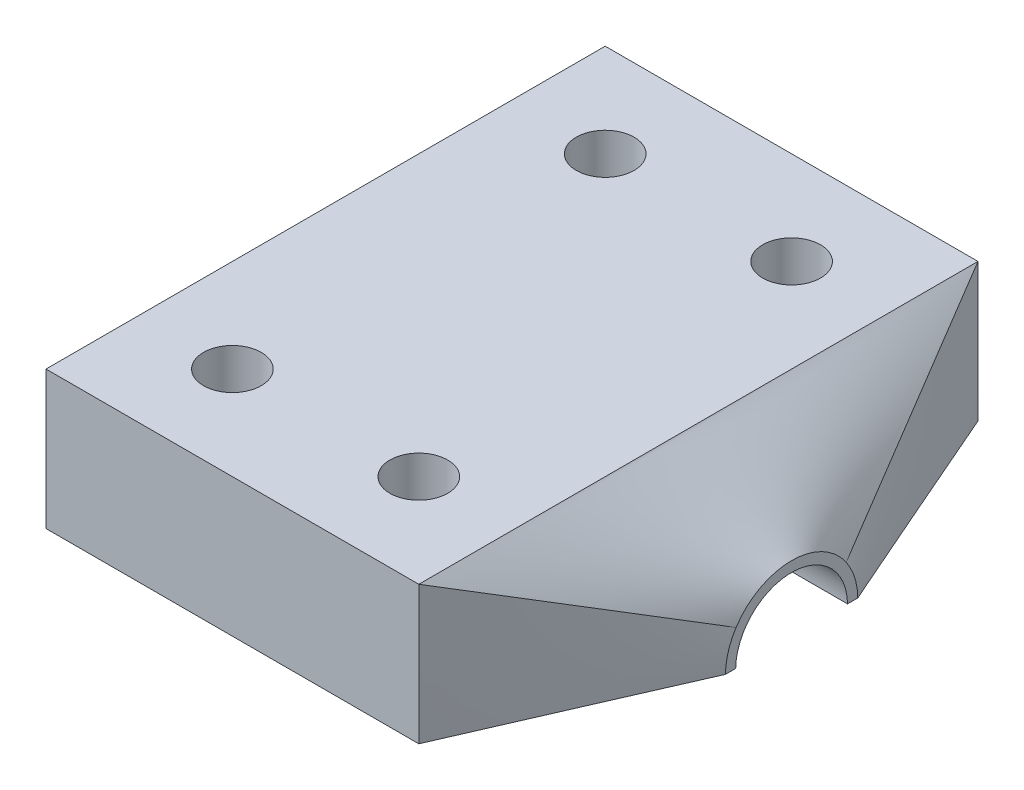
ISO-10303-21;
HEADER;
FILE_DESCRIPTION(('STEP AP214'),'2;1');
FILE_NAME('part.step','',(''),(''),'','','');
FILE_SCHEMA(('AUTOMOTIVE_DESIGN { 1 0 10303 214 1 1 1 1 }'));
ENDSEC;
DATA;
#1=APPLICATION_CONTEXT('core data for automotive mechanical design processes');
#2=APPLICATION_PROTOCOL_DEFINITION('international standard','automotive_design',2000,#1);
#3=PRODUCT_CONTEXT('',#1,'mechanical');
#4=PRODUCT('Part','Part','',(#3));
#5=PRODUCT_RELATED_PRODUCT_CATEGORY('part','',(#4));
#6=PRODUCT_DEFINITION_FORMATION('','',#4);
#7=PRODUCT_DEFINITION_CONTEXT('part definition',#1,'design');
#8=PRODUCT_DEFINITION('design','',#6,#7);
#9=PRODUCT_DEFINITION_SHAPE('','',#8);
#10=(LENGTH_UNIT() NAMED_UNIT(*) SI_UNIT(.MILLI.,.METRE.));
#11=(NAMED_UNIT(*) PLANE_ANGLE_UNIT() SI_UNIT($,.RADIAN.));
#12=(NAMED_UNIT(*) SI_UNIT($,.STERADIAN.) SOLID_ANGLE_UNIT());
#13=UNCERTAINTY_MEASURE_WITH_UNIT(LENGTH_MEASURE(1.E-05),#10,'distance_accuracy_value','');
#14=(GEOMETRIC_REPRESENTATION_CONTEXT(3) GLOBAL_UNCERTAINTY_ASSIGNED_CONTEXT((#13)) GLOBAL_UNIT_ASSIGNED_CONTEXT((#10,
#11,#12)) REPRESENTATION_CONTEXT('',''));
#15=CARTESIAN_POINT('',(0.,0.,0.));
#16=DIRECTION('',(0.,0.,1.));
#17=DIRECTION('',(1.,0.,0.));
#18=AXIS2_PLACEMENT_3D('',#15,#16,#17);
#19=CARTESIAN_POINT('',(45.05,0.0370257028590008,30.0127524367651));
#20=DIRECTION('',(0.,-1.,0.));
#21=DIRECTION('',(1.,0.,0.));
#22=AXIS2_PLACEMENT_3D('',#19,#20,#21);
#23=PLANE('',#22);
#24=CARTESIAN_POINT('',(35.05,0.0370257028589997,25.));
#25=DIRECTION('',(0.,-1.,0.));
#26=DIRECTION('',(1.,0.,0.));
#27=AXIS2_PLACEMENT_3D('',#24,#25,#26);
#28=CIRCLE('',#27,1.55);
#29=CARTESIAN_POINT('',(35.05,0.0370257028590015,26.55));
#30=VERTEX_POINT('',#29);
#31=EDGE_CURVE('E254',#30,#30,#28,.F.);
#32=ORIENTED_EDGE('',*,*,#31,.T.);
#33=EDGE_LOOP('',(#32));
#34=FACE_BOUND('',#33,.T.);
#35=DIRECTION('',(0.,0.,-1.));
#36=VECTOR('',#35,1.);
#37=CARTESIAN_POINT('',(20.05,0.0370257028589976,30.0127524367651));
#38=LINE('',#37,#36);
#39=CARTESIAN_POINT('',(20.05,0.0370257028589976,30.));
#40=VERTEX_POINT('',#39);
#41=CARTESIAN_POINT('',(20.05,0.0370257028589976,17.9997715075198));
#42=VERTEX_POINT('',#41);
#43=EDGE_CURVE('E54',#40,#42,#38,.T.);
#44=ORIENTED_EDGE('',*,*,#43,.T.);
#45=DIRECTION('',(1.,0.,0.));
#46=VECTOR('',#45,1.);
#47=CARTESIAN_POINT('',(-40.05,0.03702570285899,17.9997715075198));
#48=LINE('',#47,#46);
#49=CARTESIAN_POINT('',(45.05,0.0370257028590008,17.9997715075198));
#50=VERTEX_POINT('',#49);
#51=EDGE_CURVE('E270',#42,#50,#48,.T.);
#52=ORIENTED_EDGE('',*,*,#51,.T.);
#53=DIRECTION('',(0.,0.,-1.));
#54=VECTOR('',#53,1.);
#55=CARTESIAN_POINT('',(45.05,0.0370257028590008,15.));
#56=LINE('',#55,#54);
#57=CARTESIAN_POINT('',(45.05,0.0370258182484606,18.5498019466976));
#58=VERTEX_POINT('',#57);
#59=EDGE_CURVE('E194',#58,#50,#56,.T.);
#60=ORIENTED_EDGE('',*,*,#59,.F.);
#61=CARTESIAN_POINT('',(40.05,0.0370257028590006,30.));
#62=CARTESIAN_POINT('',(40.3292071352656,0.0370257028590005,29.3585714856252));
#63=CARTESIAN_POINT('',(40.6084542183621,0.0370257028590004,28.7171603406194));
#64=CARTESIAN_POINT('',(41.1670937679775,0.0370257028590002,27.4344011013695));
#65=CARTESIAN_POINT('',(41.446486234547,0.0370257028590002,26.7930530071475));
#66=CARTESIAN_POINT('',(42.0022245872801,0.0370257028590003,25.5179223405798));
#67=CARTESIAN_POINT('',(42.2785680325368,0.0370257028590004,24.8841387045098));
#68=CARTESIAN_POINT('',(42.831579961269,0.0370257028590006,23.6167132875389));
#69=CARTESIAN_POINT('',(43.1082484447091,0.0370257028590008,22.9830715066226));
#70=CARTESIAN_POINT('',(43.5236503493965,0.0370257028590007,22.0327827080655));
#71=CARTESIAN_POINT('',(43.6621842933627,0.0370257028590007,21.7160484972843));
#72=CARTESIAN_POINT('',(43.9394178605991,0.0370257028590006,21.0826525635881));
#73=CARTESIAN_POINT('',(44.0781174838773,0.0370257028590007,20.7659908406768));
#74=CARTESIAN_POINT('',(44.3557004955791,0.0370257028590007,20.1327477843524));
#75=CARTESIAN_POINT('',(44.4945838840896,0.0370257028590008,19.8161664509775));
#76=CARTESIAN_POINT('',(44.7029612721802,0.0370257028590007,19.3413174133347));
#77=CARTESIAN_POINT('',(44.7724291171483,0.0370257028590007,19.1830382322972));
#78=CARTESIAN_POINT('',(44.9112918623569,0.0370257028590009,18.8664478837573));
#79=CARTESIAN_POINT('',(44.9806867625976,0.0370257028590011,18.7081367162549));
#80=CARTESIAN_POINT('',(45.05,0.0370257028590016,18.5497897364898));
#81=B_SPLINE_CURVE_WITH_KNOTS('',3,(#61,#62,#63,#64,#65,#66,#67,#68,#69,#70,#71,#72,#73,#74,#75,
#76,#77,#78,#79,#80),.UNSPECIFIED.,.F.,.F.,(4,2,2,2,2,2,2,2,2,4),(0.,2.09868639503427,
4.19737352285042,6.27160263132695,8.34583151303325,9.38294763563716,10.4200638090277,
11.4571804738877,11.9757387772216,12.4942970798716),.UNSPECIFIED.);
#82=CARTESIAN_POINT('',(40.05,0.0370257028590008,30.));
#83=VERTEX_POINT('',#82);
#84=EDGE_CURVE('E109',#83,#58,#81,.T.);
#85=ORIENTED_EDGE('',*,*,#84,.F.);
#86=DIRECTION('',(1.,0.,0.));
#87=VECTOR('',#86,1.);
#88=CARTESIAN_POINT('',(0.,0.0370257028589951,30.));
#89=LINE('',#88,#87);
#90=EDGE_CURVE('E243',#40,#83,#89,.T.);
#91=ORIENTED_EDGE('',*,*,#90,.F.);
#92=EDGE_LOOP('',(#44,#52,#60,#85,#91));
#93=FACE_BOUND('',#92,.T.);
#94=CARTESIAN_POINT('',(25.05,0.0370257028589997,25.));
#95=DIRECTION('',(0.,-1.,0.));
#96=DIRECTION('',(1.,0.,0.));
#97=AXIS2_PLACEMENT_3D('',#94,#95,#96);
#98=CIRCLE('',#97,1.55);
#99=CARTESIAN_POINT('',(25.05,0.0370257028590015,26.55));
#100=VERTEX_POINT('',#99);
#101=EDGE_CURVE('E257',#100,#100,#98,.F.);
#102=ORIENTED_EDGE('',*,*,#101,.T.);
#103=EDGE_LOOP('',(#102));
#104=FACE_BOUND('',#103,.T.);
#105=ADVANCED_FACE('F38',(#34,#93,#104),#23,.T.);
#106=CARTESIAN_POINT('',(45.05,0.0370257028590008,12.0002284924802));
#107=VERTEX_POINT('',#106);
#108=CARTESIAN_POINT('',(45.05,0.0370256987457916,11.4501936569152));
#109=VERTEX_POINT('',#108);
#110=EDGE_CURVE('E193',#107,#109,#56,.T.);
#111=ORIENTED_EDGE('',*,*,#110,.F.);
#112=DIRECTION('',(1.,0.,0.));
#113=VECTOR('',#112,1.);
#114=CARTESIAN_POINT('',(-40.05,0.03702570285899,12.0002284924802));
#115=LINE('',#114,#113);
#116=CARTESIAN_POINT('',(20.05,0.0370257028589976,12.0002284924802));
#117=VERTEX_POINT('',#116);
#118=EDGE_CURVE('E266',#107,#117,#115,.F.);
#119=ORIENTED_EDGE('',*,*,#118,.T.);
#120=CARTESIAN_POINT('',(20.05,0.0370257028589976,0.));
#121=VERTEX_POINT('',#120);
#122=EDGE_CURVE('E11',#117,#121,#38,.T.);
#123=ORIENTED_EDGE('',*,*,#122,.T.);
#124=DIRECTION('',(1.,0.,0.));
#125=VECTOR('',#124,1.);
#126=CARTESIAN_POINT('',(0.,0.0370257028589951,0.));
#127=LINE('',#126,#125);
#128=CARTESIAN_POINT('',(40.05,0.0370257028590008,0.));
#129=VERTEX_POINT('',#128);
#130=EDGE_CURVE('E265',#121,#129,#127,.T.);
#131=ORIENTED_EDGE('',*,*,#130,.T.);
#132=CARTESIAN_POINT('',(45.05,0.0370257059285482,11.4501932563122));
#133=CARTESIAN_POINT('',(44.9804625166813,0.0370257039614731,11.2914067524102));
#134=CARTESIAN_POINT('',(44.9108035531583,0.0370257031544413,11.1326735887409));
#135=CARTESIAN_POINT('',(44.7713727466116,0.0370257025635602,10.8152568324995));
#136=CARTESIAN_POINT('',(44.7016009035911,0.0370257027797109,10.6565732399259));
#137=CARTESIAN_POINT('',(44.562074404052,0.0370257029382906,10.3391984826073));
#138=CARTESIAN_POINT('',(44.4923197475361,0.0370257028807197,10.1805073178611));
#139=CARTESIAN_POINT('',(44.3528563580479,0.0370257028372818,9.8631048107067));
#140=CARTESIAN_POINT('',(44.2831476250742,0.0370257028514148,9.7043934682992));
#141=CARTESIAN_POINT('',(44.0741129700596,0.0370257028741726,9.2282195789992));
#142=CARTESIAN_POINT('',(43.9348784701332,0.0370257028631564,8.9107168931688));
#143=CARTESIAN_POINT('',(43.6566409898737,0.0370257028548449,8.27561014736592));
#144=CARTESIAN_POINT('',(43.5176380095165,0.0370257028575497,7.95800608740401));
#145=CARTESIAN_POINT('',(43.1004572100972,0.0370257028619075,7.00404775090638));
#146=CARTESIAN_POINT('',(42.8225570814266,0.0370257028597831,6.36757204723251));
#147=CARTESIAN_POINT('',(42.2672100536651,0.0370257028582178,5.09442287175885));
#148=CARTESIAN_POINT('',(41.9897631546731,0.0370257028587768,4.457749399916));
#149=CARTESIAN_POINT('',(41.4351552447464,0.0370257028592238,3.18427680911127));
#150=CARTESIAN_POINT('',(41.1579942342488,0.0370257028591119,2.5474776899591));
#151=CARTESIAN_POINT('',(40.6038704986088,0.0370257028588887,1.2737936657087));
#152=CARTESIAN_POINT('',(40.3269077733397,0.0370257028587775,0.636908760665631));
#153=CARTESIAN_POINT('',(40.05,0.0370257028590025,0.));
#154=B_SPLINE_CURVE_WITH_KNOTS('',3,(#132,#133,#134,#135,#136,#137,#138,#139,#140,#141,#142,
#143,#144,#145,#146,#147,#148,#149,#150,#151,#152,#153),.UNSPECIFIED.,.F.,.F.,(4,2,2,2,2,2,2,2,
2,2,4),(0.,0.520035878670811,1.04007174301885,1.56010768981918,2.08014361904961,
3.12021457011607,4.160285412682,6.24378410013633,8.32728324129482,10.4107855621992,
12.4942865497071),.UNSPECIFIED.);
#155=EDGE_CURVE('E178',#109,#129,#154,.T.);
#156=ORIENTED_EDGE('',*,*,#155,.F.);
#157=EDGE_LOOP('',(#111,#119,#123,#131,#156));
#158=FACE_BOUND('',#157,.T.);
#159=CARTESIAN_POINT('',(25.05,0.0370257028589997,5.));
#160=DIRECTION('',(0.,-1.,0.));
#161=DIRECTION('',(1.,0.,0.));
#162=AXIS2_PLACEMENT_3D('',#159,#160,#161);
#163=CIRCLE('',#162,1.55);
#164=CARTESIAN_POINT('',(25.05,0.0370257028590015,6.55));
#165=VERTEX_POINT('',#164);
#166=EDGE_CURVE('E302',#165,#165,#163,.F.);
#167=ORIENTED_EDGE('',*,*,#166,.T.);
#168=EDGE_LOOP('',(#167));
#169=FACE_BOUND('',#168,.T.);
#170=CARTESIAN_POINT('',(35.05,0.0370257028589997,5.));
#171=DIRECTION('',(0.,-1.,0.));
#172=DIRECTION('',(1.,0.,0.));
#173=AXIS2_PLACEMENT_3D('',#170,#171,#172);
#174=CIRCLE('',#173,1.55);
#175=CARTESIAN_POINT('',(35.05,0.0370257028590015,6.55));
#176=VERTEX_POINT('',#175);
#177=EDGE_CURVE('E299',#176,#176,#174,.F.);
#178=ORIENTED_EDGE('',*,*,#177,.T.);
#179=EDGE_LOOP('',(#178));
#180=FACE_BOUND('',#179,.T.);
#181=ADVANCED_FACE('F207',(#158,#169,#180),#23,.T.);
#182=CARTESIAN_POINT('',(20.05,0.0370257028589976,30.0127524367651));
#183=DIRECTION('',(-1.,0.,0.));
#184=DIRECTION('',(0.,0.,1.));
#185=AXIS2_PLACEMENT_3D('',#182,#183,#184);
#186=PLANE('',#185);
#187=DIRECTION('',(0.,-1.,0.));
#188=VECTOR('',#187,1.);
#189=CARTESIAN_POINT('',(20.05,0.,30.));
#190=LINE('',#189,#188);
#191=CARTESIAN_POINT('',(20.05,7.45000000000001,30.));
#192=VERTEX_POINT('',#191);
#193=EDGE_CURVE('E240',#192,#40,#190,.T.);
#194=ORIENTED_EDGE('',*,*,#193,.F.);
#195=DIRECTION('',(0.,0.,1.));
#196=VECTOR('',#195,1.);
#197=CARTESIAN_POINT('',(20.05,7.45000000000001,-28.2842712474619));
#198=LINE('',#197,#196);
#199=CARTESIAN_POINT('',(20.05,7.45000000000001,0.));
#200=VERTEX_POINT('',#199);
#201=EDGE_CURVE('E183',#200,#192,#198,.T.);
#202=ORIENTED_EDGE('',*,*,#201,.F.);
#203=DIRECTION('',(0.,-1.,0.));
#204=VECTOR('',#203,1.);
#205=CARTESIAN_POINT('',(20.05,0.,0.));
#206=LINE('',#205,#204);
#207=EDGE_CURVE('E263',#200,#121,#206,.T.);
#208=ORIENTED_EDGE('',*,*,#207,.T.);
#209=ORIENTED_EDGE('',*,*,#122,.F.);
#210=CARTESIAN_POINT('',(20.05,0.,15.));
#211=DIRECTION('',(-1.,0.,0.));
#212=DIRECTION('',(0.,0.,1.));
#213=AXIS2_PLACEMENT_3D('',#210,#211,#212);
#214=CIRCLE('',#213,3.);
#215=EDGE_CURVE('E305',#117,#42,#214,.F.);
#216=ORIENTED_EDGE('',*,*,#215,.T.);
#217=ORIENTED_EDGE('',*,*,#43,.F.);
#218=EDGE_LOOP('',(#194,#202,#208,#209,#216,#217));
#219=FACE_BOUND('',#218,.T.);
#220=ADVANCED_FACE('F209',(#219),#186,.T.);
#221=CARTESIAN_POINT('',(20.05,7.45000000000001,-28.2842712474619));
#222=DIRECTION('',(0.,1.,0.));
#223=DIRECTION('',(0.,0.,1.));
#224=AXIS2_PLACEMENT_3D('',#221,#222,#223);
#225=PLANE('',#224);
#226=CARTESIAN_POINT('',(25.05,7.45000000000001,25.));
#227=DIRECTION('',(0.,1.,0.));
#228=DIRECTION('',(0.,0.,-1.));
#229=AXIS2_PLACEMENT_3D('',#226,#227,#228);
#230=CIRCLE('',#229,1.55);
#231=CARTESIAN_POINT('',(25.05,7.45,26.55));
#232=VERTEX_POINT('',#231);
#233=EDGE_CURVE('E284',#232,#232,#230,.T.);
#234=ORIENTED_EDGE('',*,*,#233,.F.);
#235=EDGE_LOOP('',(#234));
#236=FACE_BOUND('',#235,.T.);
#237=CARTESIAN_POINT('',(35.05,7.45000000000001,25.));
#238=DIRECTION('',(0.,1.,0.));
#239=DIRECTION('',(0.,0.,-1.));
#240=AXIS2_PLACEMENT_3D('',#237,#238,#239);
#241=CIRCLE('',#240,1.55);
#242=CARTESIAN_POINT('',(35.05,7.45,26.55));
#243=VERTEX_POINT('',#242);
#244=EDGE_CURVE('E287',#243,#243,#241,.T.);
#245=ORIENTED_EDGE('',*,*,#244,.F.);
#246=EDGE_LOOP('',(#245));
#247=FACE_BOUND('',#246,.T.);
#248=CARTESIAN_POINT('',(35.05,7.45000000000001,5.));
#249=DIRECTION('',(0.,1.,0.));
#250=DIRECTION('',(0.,0.,1.));
#251=AXIS2_PLACEMENT_3D('',#248,#249,#250);
#252=CIRCLE('',#251,1.55);
#253=CARTESIAN_POINT('',(35.05,7.45,6.55));
#254=VERTEX_POINT('',#253);
#255=EDGE_CURVE('E292',#254,#254,#252,.T.);
#256=ORIENTED_EDGE('',*,*,#255,.F.);
#257=EDGE_LOOP('',(#256));
#258=FACE_BOUND('',#257,.T.);
#259=CARTESIAN_POINT('',(25.05,7.45000000000001,5.));
#260=DIRECTION('',(0.,1.,0.));
#261=DIRECTION('',(0.,0.,1.));
#262=AXIS2_PLACEMENT_3D('',#259,#260,#261);
#263=CIRCLE('',#262,1.55);
#264=CARTESIAN_POINT('',(25.05,7.45,6.55));
#265=VERTEX_POINT('',#264);
#266=EDGE_CURVE('E99',#265,#265,#263,.T.);
#267=ORIENTED_EDGE('',*,*,#266,.F.);
#268=EDGE_LOOP('',(#267));
#269=FACE_BOUND('',#268,.T.);
#270=DIRECTION('',(1.,0.,0.));
#271=VECTOR('',#270,1.);
#272=CARTESIAN_POINT('',(20.05,7.45000000000001,0.));
#273=LINE('',#272,#271);
#274=CARTESIAN_POINT('',(40.05,7.45000000000001,0.));
#275=VERTEX_POINT('',#274);
#276=EDGE_CURVE('E185',#200,#275,#273,.T.);
#277=ORIENTED_EDGE('',*,*,#276,.F.);
#278=ORIENTED_EDGE('',*,*,#201,.T.);
#279=DIRECTION('',(-1.,0.,0.));
#280=VECTOR('',#279,1.);
#281=CARTESIAN_POINT('',(20.05,7.45000000000001,30.));
#282=LINE('',#281,#280);
#283=CARTESIAN_POINT('',(40.05,7.45000000000001,30.));
#284=VERTEX_POINT('',#283);
#285=EDGE_CURVE('E182',#284,#192,#282,.T.);
#286=ORIENTED_EDGE('',*,*,#285,.F.);
#287=DIRECTION('',(0.,0.,1.));
#288=VECTOR('',#287,1.);
#289=CARTESIAN_POINT('',(40.05,7.45000000000001,-28.2842712474619));
#290=LINE('',#289,#288);
#291=EDGE_CURVE('E95',#275,#284,#290,.T.);
#292=ORIENTED_EDGE('',*,*,#291,.F.);
#293=EDGE_LOOP('',(#277,#278,#286,#292));
#294=FACE_BOUND('',#293,.T.);
#295=ADVANCED_FACE('F218',(#236,#247,#258,#269,#294),#225,.T.);
#296=CARTESIAN_POINT('',(35.05,-12.5527524367651,5.));
#297=DIRECTION('',(0.,1.,0.));
#298=DIRECTION('',(0.,0.,1.));
#299=AXIS2_PLACEMENT_3D('',#296,#297,#298);
#300=CYLINDRICAL_SURFACE('',#299,1.55);
#301=CARTESIAN_POINT('',(35.05,7.45,6.55));
#302=CARTESIAN_POINT('',(35.05,7.37278151773812,6.55));
#303=CARTESIAN_POINT('',(35.05,7.29556303547623,6.55));
#304=CARTESIAN_POINT('',(35.05,7.14112607095246,6.55));
#305=CARTESIAN_POINT('',(35.05,7.06390758869057,6.55));
#306=CARTESIAN_POINT('',(35.05,6.9094706241668,6.55));
#307=CARTESIAN_POINT('',(35.05,6.83225214190492,6.55));
#308=CARTESIAN_POINT('',(35.05,6.67781517738115,6.55));
#309=CARTESIAN_POINT('',(35.05,6.60059669511926,6.55));
#310=CARTESIAN_POINT('',(35.05,6.44615973059549,6.55));
#311=CARTESIAN_POINT('',(35.05,6.36894124833361,6.55));
#312=CARTESIAN_POINT('',(35.05,6.21450428380983,6.55));
#313=CARTESIAN_POINT('',(35.05,6.13728580154795,6.55));
#314=CARTESIAN_POINT('',(35.05,5.98284883702418,6.55));
#315=CARTESIAN_POINT('',(35.05,5.90563035476229,6.55));
#316=CARTESIAN_POINT('',(35.05,5.75119339023852,6.55));
#317=CARTESIAN_POINT('',(35.05,5.67397490797664,6.55));
#318=CARTESIAN_POINT('',(35.05,5.51953794345287,6.55));
#319=CARTESIAN_POINT('',(35.05,5.44231946119098,6.55));
#320=CARTESIAN_POINT('',(35.05,5.28788249666721,6.55));
#321=CARTESIAN_POINT('',(35.05,5.21066401440532,6.55));
#322=CARTESIAN_POINT('',(35.05,5.05622704988155,6.55));
#323=CARTESIAN_POINT('',(35.05,4.97900856761967,6.55));
#324=CARTESIAN_POINT('',(35.05,4.8245716030959,6.55));
#325=CARTESIAN_POINT('',(35.05,4.74735312083401,6.55));
#326=CARTESIAN_POINT('',(35.05,4.59291615631024,6.55));
#327=CARTESIAN_POINT('',(35.05,4.51569767404836,6.55));
#328=CARTESIAN_POINT('',(35.05,4.36126070952458,6.55));
#329=CARTESIAN_POINT('',(35.05,4.2840422272627,6.55));
#330=CARTESIAN_POINT('',(35.05,4.12960526273893,6.55));
#331=CARTESIAN_POINT('',(35.05,4.05238678047704,6.55));
#332=CARTESIAN_POINT('',(35.05,3.89794981595327,6.55));
#333=CARTESIAN_POINT('',(35.05,3.82073133369139,6.55));
#334=CARTESIAN_POINT('',(35.05,3.66629436916761,6.55));
#335=CARTESIAN_POINT('',(35.05,3.58907588690573,6.55));
#336=CARTESIAN_POINT('',(35.05,3.43463892238196,6.55));
#337=CARTESIAN_POINT('',(35.05,3.35742044012007,6.55));
#338=CARTESIAN_POINT('',(35.05,3.2029834755963,6.55));
#339=CARTESIAN_POINT('',(35.05,3.12576499333442,6.55));
#340=CARTESIAN_POINT('',(35.05,2.97132802881065,6.55));
#341=CARTESIAN_POINT('',(35.05,2.89410954654876,6.55));
#342=CARTESIAN_POINT('',(35.05,2.73967258202499,6.55));
#343=CARTESIAN_POINT('',(35.05,2.66245409976311,6.55));
#344=CARTESIAN_POINT('',(35.05,2.50801713523934,6.55));
#345=CARTESIAN_POINT('',(35.05,2.43079865297745,6.55));
#346=CARTESIAN_POINT('',(35.05,2.27636168845368,6.55));
#347=CARTESIAN_POINT('',(35.05,2.19914320619179,6.55));
#348=CARTESIAN_POINT('',(35.05,2.04470624166802,6.55));
#349=CARTESIAN_POINT('',(35.05,1.96748775940614,6.55));
#350=CARTESIAN_POINT('',(35.05,1.81305079488237,6.55));
#351=CARTESIAN_POINT('',(35.05,1.73583231262048,6.55));
#352=CARTESIAN_POINT('',(35.05,1.58139534809671,6.55));
#353=CARTESIAN_POINT('',(35.05,1.50417686583483,6.55));
#354=CARTESIAN_POINT('',(35.05,1.34973990131105,6.55));
#355=CARTESIAN_POINT('',(35.05,1.27252141904917,6.55));
#356=CARTESIAN_POINT('',(35.05,1.1180844545254,6.55));
#357=CARTESIAN_POINT('',(35.05,1.04086597226351,6.55));
#358=CARTESIAN_POINT('',(35.05,0.886429007739741,6.55));
#359=CARTESIAN_POINT('',(35.05,0.809210525477856,6.55));
#360=CARTESIAN_POINT('',(35.05,0.654773560954086,6.55));
#361=CARTESIAN_POINT('',(35.05,0.5775550786922,6.55));
#362=CARTESIAN_POINT('',(35.05,0.423118114168428,6.55));
#363=CARTESIAN_POINT('',(35.05,0.345899631906543,6.55));
#364=CARTESIAN_POINT('',(35.05,0.191462667382772,6.55));
#365=CARTESIAN_POINT('',(35.05,0.114244185120887,6.55));
#366=CARTESIAN_POINT('',(35.05,0.0370257028590015,6.55));
#367=B_SPLINE_CURVE_WITH_KNOTS('',3,(#301,#302,#303,#304,#305,#306,#307,#308,#309,#310,#311,
#312,#313,#314,#315,#316,#317,#318,#319,#320,#321,#322,#323,#324,#325,#326,#327,#328,#329,#330,
#331,#332,#333,#334,#335,#336,#337,#338,#339,#340,#341,#342,#343,#344,#345,#346,#347,#348,#349,
#350,#351,#352,#353,#354,#355,#356,#357,#358,#359,#360,#361,#362,#363,#364,#365,#366),
.UNSPECIFIED.,.F.,.F.,(4,2,2,2,2,2,2,2,2,2,2,2,2,2,2,2,2,2,2,2,2,2,2,2,2,2,2,2,2,2,2,2,4),(0.,
0.231655446785658,0.463310893571312,0.69496634035697,0.926621787142624,1.15827723392828,
1.38993268071394,1.62158812749959,1.85324357428525,2.08489902107091,2.31655446785656,
2.54820991464222,2.77986536142788,3.01152080821353,3.24317625499919,3.47483170178484,
3.7064871485705,3.93814259535616,4.16979804214181,4.40145348892747,4.63310893571312,
4.86476438249878,5.09641982928444,5.32807527607009,5.55973072285575,5.79138616964141,
6.02304161642706,6.25469706321272,6.48635250999838,6.71800795678403,6.94966340356969,
7.18131885035534,7.412974297141),.UNSPECIFIED.);
#368=EDGE_CURVE('BSEAM220',#254,#176,#367,.T.);
#369=ORIENTED_EDGE('',*,*,#255,.T.);
#370=ORIENTED_EDGE('',*,*,#177,.F.);
#371=ORIENTED_EDGE('',*,*,#368,.T.);
#372=ORIENTED_EDGE('',*,*,#368,.F.);
#373=EDGE_LOOP('',(#369,#371,#370,#372));
#374=FACE_BOUND('',#373,.T.);
#375=ADVANCED_FACE('F220',(#374),#300,.F.);
#376=CARTESIAN_POINT('',(25.05,-12.5527524367651,5.));
#377=DIRECTION('',(0.,1.,0.));
#378=DIRECTION('',(0.,0.,1.));
#379=AXIS2_PLACEMENT_3D('',#376,#377,#378);
#380=CYLINDRICAL_SURFACE('',#379,1.55);
#381=CARTESIAN_POINT('',(25.05,7.45,6.55));
#382=CARTESIAN_POINT('',(25.05,7.37278151773812,6.55));
#383=CARTESIAN_POINT('',(25.05,7.29556303547623,6.55));
#384=CARTESIAN_POINT('',(25.05,7.14112607095246,6.55));
#385=CARTESIAN_POINT('',(25.05,7.06390758869057,6.55));
#386=CARTESIAN_POINT('',(25.05,6.9094706241668,6.55));
#387=CARTESIAN_POINT('',(25.05,6.83225214190492,6.55));
#388=CARTESIAN_POINT('',(25.05,6.67781517738115,6.55));
#389=CARTESIAN_POINT('',(25.05,6.60059669511926,6.55));
#390=CARTESIAN_POINT('',(25.05,6.44615973059549,6.55));
#391=CARTESIAN_POINT('',(25.05,6.36894124833361,6.55));
#392=CARTESIAN_POINT('',(25.05,6.21450428380983,6.55));
#393=CARTESIAN_POINT('',(25.05,6.13728580154795,6.55));
#394=CARTESIAN_POINT('',(25.05,5.98284883702418,6.55));
#395=CARTESIAN_POINT('',(25.05,5.90563035476229,6.55));
#396=CARTESIAN_POINT('',(25.05,5.75119339023852,6.55));
#397=CARTESIAN_POINT('',(25.05,5.67397490797664,6.55));
#398=CARTESIAN_POINT('',(25.05,5.51953794345287,6.55));
#399=CARTESIAN_POINT('',(25.05,5.44231946119098,6.55));
#400=CARTESIAN_POINT('',(25.05,5.28788249666721,6.55));
#401=CARTESIAN_POINT('',(25.05,5.21066401440532,6.55));
#402=CARTESIAN_POINT('',(25.05,5.05622704988155,6.55));
#403=CARTESIAN_POINT('',(25.05,4.97900856761967,6.55));
#404=CARTESIAN_POINT('',(25.05,4.8245716030959,6.55));
#405=CARTESIAN_POINT('',(25.05,4.74735312083401,6.55));
#406=CARTESIAN_POINT('',(25.05,4.59291615631024,6.55));
#407=CARTESIAN_POINT('',(25.05,4.51569767404836,6.55));
#408=CARTESIAN_POINT('',(25.05,4.36126070952458,6.55));
#409=CARTESIAN_POINT('',(25.05,4.2840422272627,6.55));
#410=CARTESIAN_POINT('',(25.05,4.12960526273893,6.55));
#411=CARTESIAN_POINT('',(25.05,4.05238678047704,6.55));
#412=CARTESIAN_POINT('',(25.05,3.89794981595327,6.55));
#413=CARTESIAN_POINT('',(25.05,3.82073133369139,6.55));
#414=CARTESIAN_POINT('',(25.05,3.66629436916761,6.55));
#415=CARTESIAN_POINT('',(25.05,3.58907588690573,6.55));
#416=CARTESIAN_POINT('',(25.05,3.43463892238196,6.55));
#417=CARTESIAN_POINT('',(25.05,3.35742044012007,6.55));
#418=CARTESIAN_POINT('',(25.05,3.2029834755963,6.55));
#419=CARTESIAN_POINT('',(25.05,3.12576499333442,6.55));
#420=CARTESIAN_POINT('',(25.05,2.97132802881065,6.55));
#421=CARTESIAN_POINT('',(25.05,2.89410954654876,6.55));
#422=CARTESIAN_POINT('',(25.05,2.73967258202499,6.55));
#423=CARTESIAN_POINT('',(25.05,2.66245409976311,6.55));
#424=CARTESIAN_POINT('',(25.05,2.50801713523934,6.55));
#425=CARTESIAN_POINT('',(25.05,2.43079865297745,6.55));
#426=CARTESIAN_POINT('',(25.05,2.27636168845368,6.55));
#427=CARTESIAN_POINT('',(25.05,2.19914320619179,6.55));
#428=CARTESIAN_POINT('',(25.05,2.04470624166802,6.55));
#429=CARTESIAN_POINT('',(25.05,1.96748775940614,6.55));
#430=CARTESIAN_POINT('',(25.05,1.81305079488237,6.55));
#431=CARTESIAN_POINT('',(25.05,1.73583231262048,6.55));
#432=CARTESIAN_POINT('',(25.05,1.58139534809671,6.55));
#433=CARTESIAN_POINT('',(25.05,1.50417686583483,6.55));
#434=CARTESIAN_POINT('',(25.05,1.34973990131105,6.55));
#435=CARTESIAN_POINT('',(25.05,1.27252141904917,6.55));
#436=CARTESIAN_POINT('',(25.05,1.1180844545254,6.55));
#437=CARTESIAN_POINT('',(25.05,1.04086597226351,6.55));
#438=CARTESIAN_POINT('',(25.05,0.886429007739741,6.55));
#439=CARTESIAN_POINT('',(25.05,0.809210525477856,6.55));
#440=CARTESIAN_POINT('',(25.05,0.654773560954086,6.55));
#441=CARTESIAN_POINT('',(25.05,0.5775550786922,6.55));
#442=CARTESIAN_POINT('',(25.05,0.423118114168428,6.55));
#443=CARTESIAN_POINT('',(25.05,0.345899631906543,6.55));
#444=CARTESIAN_POINT('',(25.05,0.191462667382772,6.55));
#445=CARTESIAN_POINT('',(25.05,0.114244185120887,6.55));
#446=CARTESIAN_POINT('',(25.05,0.0370257028590015,6.55));
#447=B_SPLINE_CURVE_WITH_KNOTS('',3,(#381,#382,#383,#384,#385,#386,#387,#388,#389,#390,#391,
#392,#393,#394,#395,#396,#397,#398,#399,#400,#401,#402,#403,#404,#405,#406,#407,#408,#409,#410,
#411,#412,#413,#414,#415,#416,#417,#418,#419,#420,#421,#422,#423,#424,#425,#426,#427,#428,#429,
#430,#431,#432,#433,#434,#435,#436,#437,#438,#439,#440,#441,#442,#443,#444,#445,#446),
.UNSPECIFIED.,.F.,.F.,(4,2,2,2,2,2,2,2,2,2,2,2,2,2,2,2,2,2,2,2,2,2,2,2,2,2,2,2,2,2,2,2,4),(0.,
0.231655446785658,0.463310893571312,0.69496634035697,0.926621787142624,1.15827723392828,
1.38993268071394,1.62158812749959,1.85324357428525,2.08489902107091,2.31655446785656,
2.54820991464222,2.77986536142788,3.01152080821353,3.24317625499919,3.47483170178484,
3.7064871485705,3.93814259535616,4.16979804214181,4.40145348892747,4.63310893571312,
4.86476438249878,5.09641982928444,5.32807527607009,5.55973072285575,5.79138616964141,
6.02304161642706,6.25469706321272,6.48635250999838,6.71800795678403,6.94966340356969,
7.18131885035534,7.412974297141),.UNSPECIFIED.);
#448=EDGE_CURVE('BSEAM223',#265,#165,#447,.T.);
#449=ORIENTED_EDGE('',*,*,#266,.T.);
#450=ORIENTED_EDGE('',*,*,#166,.F.);
#451=ORIENTED_EDGE('',*,*,#448,.T.);
#452=ORIENTED_EDGE('',*,*,#448,.F.);
#453=EDGE_LOOP('',(#449,#451,#450,#452));
#454=FACE_BOUND('',#453,.T.);
#455=ADVANCED_FACE('F223',(#454),#380,.F.);
#456=CARTESIAN_POINT('',(0.,0.,30.));
#457=DIRECTION('',(0.,0.,1.));
#458=DIRECTION('',(1.,0.,0.));
#459=AXIS2_PLACEMENT_3D('',#456,#457,#458);
#460=PLANE('',#459);
#461=ORIENTED_EDGE('',*,*,#193,.T.);
#462=ORIENTED_EDGE('',*,*,#90,.T.);
#463=DIRECTION('',(0.,1.,0.));
#464=VECTOR('',#463,1.);
#465=CARTESIAN_POINT('',(40.05,0.,30.));
#466=LINE('',#465,#464);
#467=EDGE_CURVE('E113',#83,#284,#466,.T.);
#468=ORIENTED_EDGE('',*,*,#467,.T.);
#469=ORIENTED_EDGE('',*,*,#285,.T.);
#470=EDGE_LOOP('',(#461,#462,#468,#469));
#471=FACE_BOUND('',#470,.T.);
#472=ADVANCED_FACE('F227',(#471),#460,.T.);
#473=CARTESIAN_POINT('',(40.05,7.45000000000001,30.));
#474=CARTESIAN_POINT('',(45.05,1.93200528156345,17.9782302785397));
#475=CARTESIAN_POINT('',(40.05,5.78333333333334,30.));
#476=CARTESIAN_POINT('',(45.05,1.6566677949118,18.156844230005));
#477=CARTESIAN_POINT('',(40.05,4.11666666666668,30.));
#478=CARTESIAN_POINT('',(45.05,1.34401932652227,18.3043595697716));
#479=CARTESIAN_POINT('',(40.05,0.783333333333353,30.));
#480=CARTESIAN_POINT('',(45.05,0.672348132236313,18.5033024570375));
#481=CARTESIAN_POINT('',(40.05,-0.883333333333312,30.));
#482=CARTESIAN_POINT('',(45.05,0.313756998740099,18.5542121956931));
#483=CARTESIAN_POINT('',(40.05,-4.21666666666664,30.));
#484=CARTESIAN_POINT('',(45.05,-0.402755712185647,18.5452299816195));
#485=CARTESIAN_POINT('',(40.05,-5.88333333333331,30.));
#486=CARTESIAN_POINT('',(45.05,-0.759957947065343,18.4853470465793));
#487=CARTESIAN_POINT('',(40.05,-9.21666666666665,30.));
#488=CARTESIAN_POINT('',(45.05,-1.42643094772676,18.2696291636475));
#489=CARTESIAN_POINT('',(40.05,-10.8833333333333,30.));
#490=CARTESIAN_POINT('',(45.05,-1.73528323721681,18.1143226810734));
#491=CARTESIAN_POINT('',(40.05,-12.55,30.));
#492=CARTESIAN_POINT('',(45.05,-2.00605668728151,17.9288626747277));
#493=B_SPLINE_SURFACE_WITH_KNOTS('',3,1,((#473,#474),(#475,#476),(#477,#478),(#479,#480),(#481,
#482),(#483,#484),(#485,#486),(#487,#488),(#489,#490),(#491,#492)),.UNSPECIFIED.,.F.,.F.,.F.,(4,
2,2,2,4),(2,2),(0.,0.25,0.5,0.75,1.),(0.,1.),.UNSPECIFIED.);
#494=CARTESIAN_POINT('',(45.05,0.,15.));
#495=DIRECTION('',(1.,0.,0.));
#496=DIRECTION('',(0.,1.,0.));
#497=AXIS2_PLACEMENT_3D('',#494,#495,#496);
#498=CIRCLE('',#497,3.55);
#499=CARTESIAN_POINT('',(45.05,1.93200528156345,17.9782302785397));
#500=VERTEX_POINT('',#499);
#501=EDGE_CURVE('E104',#500,#58,#498,.T.);
#502=DIRECTION('',(-0.353578837739509,0.39020923183951,0.850128673137189));
#503=VECTOR('',#502,1.);
#504=CARTESIAN_POINT('',(42.55,4.69100264078173,23.9891151392699));
#505=LINE('',#504,#503);
#506=EDGE_CURVE('E89',#500,#284,#505,.T.);
#507=ORIENTED_EDGE('',*,*,#467,.F.);
#508=ORIENTED_EDGE('',*,*,#84,.T.);
#509=ORIENTED_EDGE('',*,*,#501,.F.);
#510=ORIENTED_EDGE('',*,*,#506,.T.);
#511=EDGE_LOOP('',(#507,#508,#509,#510));
#512=FACE_BOUND('',#511,.T.);
#513=ADVANCED_FACE('F106',(#512),#493,.T.);
#514=CARTESIAN_POINT('',(40.05,7.45000000000001,0.));
#515=CARTESIAN_POINT('',(45.05,2.00605668728148,12.0711373252723));
#516=CARTESIAN_POINT('',(40.05,7.45000000000001,1.25));
#517=CARTESIAN_POINT('',(45.05,2.20913677483001,12.2102323300315));
#518=CARTESIAN_POINT('',(40.05,7.45000000000001,2.5));
#519=CARTESIAN_POINT('',(45.05,2.40932648954317,12.3785465388223));
#520=CARTESIAN_POINT('',(40.05,7.45000000000001,5.00000000000001));
#521=CARTESIAN_POINT('',(45.05,2.78145667522234,12.7773054311948));
#522=CARTESIAN_POINT('',(40.05,7.45000000000001,6.25000000000001));
#523=CARTESIAN_POINT('',(45.05,2.95320089519986,13.0079107063377));
#524=CARTESIAN_POINT('',(40.05,7.45000000000001,8.75000000000001));
#525=CARTESIAN_POINT('',(45.05,3.24190997530379,13.5235735733336));
#526=CARTESIAN_POINT('',(40.05,7.45000000000001,10.));
#527=CARTESIAN_POINT('',(45.05,3.35855451215529,13.8086212373491));
#528=CARTESIAN_POINT('',(40.05,7.45000000000001,12.5));
#529=CARTESIAN_POINT('',(45.05,3.51457505264697,14.4109041109244));
#530=CARTESIAN_POINT('',(40.05,7.45000000000001,13.75));
#531=CARTESIAN_POINT('',(45.05,3.55369031081981,14.7278738444209));
#532=CARTESIAN_POINT('',(40.05,7.45,16.25));
#533=CARTESIAN_POINT('',(45.05,3.54575186649275,15.3611248690246));
#534=CARTESIAN_POINT('',(40.05,7.45,17.5));
#535=CARTESIAN_POINT('',(45.05,3.49870307449324,15.6770144486979));
#536=CARTESIAN_POINT('',(40.05,7.45,20.));
#537=CARTESIAN_POINT('',(45.05,3.32763348251853,16.2751969154746));
#538=CARTESIAN_POINT('',(40.05,7.45000000000001,21.25));
#539=CARTESIAN_POINT('',(45.05,3.20388000104832,16.5572309463325));
#540=CARTESIAN_POINT('',(40.05,7.45000000000001,23.75));
#541=CARTESIAN_POINT('',(45.05,2.90233496552031,17.0654943788961));
#542=CARTESIAN_POINT('',(40.05,7.45000000000001,25.));
#543=CARTESIAN_POINT('',(45.05,2.72486388294649,17.2917218857769));
#544=CARTESIAN_POINT('',(40.05,7.45000000000001,27.5));
#545=CARTESIAN_POINT('',(45.05,2.3428545166664,17.6810268734331));
#546=CARTESIAN_POINT('',(40.05,7.45000000000001,28.75));
#547=CARTESIAN_POINT('',(45.05,2.13850839655219,17.8442698149408));
#548=CARTESIAN_POINT('',(40.05,7.45000000000001,30.));
#549=CARTESIAN_POINT('',(45.05,1.93200528156345,17.9782302785397));
#550=B_SPLINE_SURFACE_WITH_KNOTS('',3,1,((#514,#515),(#516,#517),(#518,#519),(#520,#521),(#522,
#523),(#524,#525),(#526,#527),(#528,#529),(#530,#531),(#532,#533),(#534,#535),(#536,#537),(#538,
#539),(#540,#541),(#542,#543),(#544,#545),(#546,#547),(#548,#549)),.UNSPECIFIED.,.F.,.F.,.F.,(4,
2,2,2,2,2,2,2,4),(2,2),(0.,0.125,0.25,0.375,0.5,0.625,0.75,0.875,1.),(0.,1.),.UNSPECIFIED.);
#551=CARTESIAN_POINT('',(45.05,2.00605668728148,12.0711373252723));
#552=VERTEX_POINT('',#551);
#553=EDGE_CURVE('E92',#552,#500,#498,.T.);
#554=DIRECTION('',(0.353245428484077,-0.384609617628857,0.85281481535119));
#555=VECTOR('',#554,1.);
#556=CARTESIAN_POINT('',(42.55,4.72802834364074,6.03556866263614));
#557=LINE('',#556,#555);
#558=EDGE_CURVE('E100',#275,#552,#557,.T.);
#559=ORIENTED_EDGE('',*,*,#291,.T.);
#560=ORIENTED_EDGE('',*,*,#506,.F.);
#561=ORIENTED_EDGE('',*,*,#553,.F.);
#562=ORIENTED_EDGE('',*,*,#558,.F.);
#563=EDGE_LOOP('',(#559,#560,#561,#562));
#564=FACE_BOUND('',#563,.T.);
#565=ADVANCED_FACE('F91',(#564),#550,.T.);
#566=CARTESIAN_POINT('',(0.,0.,0.));
#567=DIRECTION('',(0.,0.,1.));
#568=DIRECTION('',(1.,0.,0.));
#569=AXIS2_PLACEMENT_3D('',#566,#567,#568);
#570=PLANE('',#569);
#571=ORIENTED_EDGE('',*,*,#130,.F.);
#572=ORIENTED_EDGE('',*,*,#207,.F.);
#573=ORIENTED_EDGE('',*,*,#276,.T.);
#574=DIRECTION('',(0.,1.,0.));
#575=VECTOR('',#574,1.);
#576=CARTESIAN_POINT('',(40.05,0.,0.));
#577=LINE('',#576,#575);
#578=EDGE_CURVE('E63',#275,#129,#577,.F.);
#579=ORIENTED_EDGE('',*,*,#578,.T.);
#580=EDGE_LOOP('',(#571,#572,#573,#579));
#581=FACE_BOUND('',#580,.T.);
#582=ADVANCED_FACE('F147',(#581),#570,.F.);
#583=CARTESIAN_POINT('',(40.05,-12.55,0.));
#584=CARTESIAN_POINT('',(45.05,-1.93200528156348,12.0217697214603));
#585=CARTESIAN_POINT('',(40.05,-10.8833333333333,0.));
#586=CARTESIAN_POINT('',(45.05,-1.65666779491183,11.843155769995));
#587=CARTESIAN_POINT('',(40.05,-9.21666666666667,0.));
#588=CARTESIAN_POINT('',(45.05,-1.3440193265223,11.6956404302284));
#589=CARTESIAN_POINT('',(40.05,-5.88333333333335,0.));
#590=CARTESIAN_POINT('',(45.05,-0.672348132236343,11.4966975429625));
#591=CARTESIAN_POINT('',(40.05,-4.21666666666668,0.));
#592=CARTESIAN_POINT('',(45.05,-0.31375699874013,11.4457878043069));
#593=CARTESIAN_POINT('',(40.05,-0.883333333333348,0.));
#594=CARTESIAN_POINT('',(45.05,0.402755712185616,11.4547700183805));
#595=CARTESIAN_POINT('',(40.05,0.78333333333332,0.));
#596=CARTESIAN_POINT('',(45.05,0.759957947065313,11.5146529534207));
#597=CARTESIAN_POINT('',(40.05,4.11666666666666,0.));
#598=CARTESIAN_POINT('',(45.05,1.42643094772673,11.7303708363525));
#599=CARTESIAN_POINT('',(40.05,5.78333333333333,0.));
#600=CARTESIAN_POINT('',(45.05,1.73528323721678,11.8856773189266));
#601=CARTESIAN_POINT('',(40.05,7.45000000000001,0.));
#602=CARTESIAN_POINT('',(45.05,2.00605668728148,12.0711373252723));
#603=B_SPLINE_SURFACE_WITH_KNOTS('',3,1,((#583,#584),(#585,#586),(#587,#588),(#589,#590),(#591,
#592),(#593,#594),(#595,#596),(#597,#598),(#599,#600),(#601,#602)),.UNSPECIFIED.,.F.,.F.,.F.,(4,
2,2,2,4),(2,2),(0.,0.25,0.5,0.75,1.),(0.,1.),.UNSPECIFIED.);
#604=EDGE_CURVE('E82',#109,#552,#498,.T.);
#605=ORIENTED_EDGE('',*,*,#604,.F.);
#606=ORIENTED_EDGE('',*,*,#155,.T.);
#607=ORIENTED_EDGE('',*,*,#578,.F.);
#608=ORIENTED_EDGE('',*,*,#558,.T.);
#609=EDGE_LOOP('',(#605,#606,#607,#608));
#610=FACE_BOUND('',#609,.T.);
#611=ADVANCED_FACE('F146',(#610),#603,.T.);
#612=CARTESIAN_POINT('',(45.05,0.,15.));
#613=DIRECTION('',(1.,0.,0.));
#614=DIRECTION('',(0.,1.,0.));
#615=AXIS2_PLACEMENT_3D('',#612,#613,#614);
#616=PLANE('',#615);
#617=ORIENTED_EDGE('',*,*,#501,.T.);
#618=ORIENTED_EDGE('',*,*,#59,.T.);
#619=CARTESIAN_POINT('',(45.05,0.,15.));
#620=DIRECTION('',(1.,0.,0.));
#621=DIRECTION('',(0.,1.,0.));
#622=AXIS2_PLACEMENT_3D('',#619,#620,#621);
#623=CIRCLE('',#622,3.);
#624=EDGE_CURVE('E286',#107,#50,#623,.T.);
#625=ORIENTED_EDGE('',*,*,#624,.F.);
#626=ORIENTED_EDGE('',*,*,#110,.T.);
#627=ORIENTED_EDGE('',*,*,#604,.T.);
#628=ORIENTED_EDGE('',*,*,#553,.T.);
#629=EDGE_LOOP('',(#617,#618,#625,#626,#627,#628));
#630=FACE_BOUND('',#629,.T.);
#631=ADVANCED_FACE('F118',(#630),#616,.T.);
#632=CARTESIAN_POINT('',(-40.05,0.,15.));
#633=DIRECTION('',(1.,0.,0.));
#634=DIRECTION('',(0.,1.,0.));
#635=AXIS2_PLACEMENT_3D('',#632,#633,#634);
#636=CYLINDRICAL_SURFACE('',#635,3.);
#637=ORIENTED_EDGE('',*,*,#118,.F.);
#638=ORIENTED_EDGE('',*,*,#624,.T.);
#639=ORIENTED_EDGE('',*,*,#51,.F.);
#640=ORIENTED_EDGE('',*,*,#215,.F.);
#641=EDGE_LOOP('',(#637,#638,#639,#640));
#642=FACE_BOUND('',#641,.T.);
#643=ADVANCED_FACE('F145',(#642),#636,.F.);
#644=CARTESIAN_POINT('',(35.05,-12.5527524367651,25.));
#645=DIRECTION('',(0.,1.,0.));
#646=DIRECTION('',(0.,0.,1.));
#647=AXIS2_PLACEMENT_3D('',#644,#645,#646);
#648=CYLINDRICAL_SURFACE('',#647,1.55);
#649=CARTESIAN_POINT('',(35.05,7.45,26.55));
#650=CARTESIAN_POINT('',(35.05,7.37278151773812,26.55));
#651=CARTESIAN_POINT('',(35.05,7.29556303547623,26.55));
#652=CARTESIAN_POINT('',(35.05,7.14112607095246,26.55));
#653=CARTESIAN_POINT('',(35.05,7.06390758869057,26.55));
#654=CARTESIAN_POINT('',(35.05,6.9094706241668,26.55));
#655=CARTESIAN_POINT('',(35.05,6.83225214190492,26.55));
#656=CARTESIAN_POINT('',(35.05,6.67781517738115,26.55));
#657=CARTESIAN_POINT('',(35.05,6.60059669511926,26.55));
#658=CARTESIAN_POINT('',(35.05,6.44615973059549,26.55));
#659=CARTESIAN_POINT('',(35.05,6.36894124833361,26.55));
#660=CARTESIAN_POINT('',(35.05,6.21450428380983,26.55));
#661=CARTESIAN_POINT('',(35.05,6.13728580154795,26.55));
#662=CARTESIAN_POINT('',(35.05,5.98284883702418,26.55));
#663=CARTESIAN_POINT('',(35.05,5.90563035476229,26.55));
#664=CARTESIAN_POINT('',(35.05,5.75119339023852,26.55));
#665=CARTESIAN_POINT('',(35.05,5.67397490797664,26.55));
#666=CARTESIAN_POINT('',(35.05,5.51953794345287,26.55));
#667=CARTESIAN_POINT('',(35.05,5.44231946119098,26.55));
#668=CARTESIAN_POINT('',(35.05,5.28788249666721,26.55));
#669=CARTESIAN_POINT('',(35.05,5.21066401440532,26.55));
#670=CARTESIAN_POINT('',(35.05,5.05622704988155,26.55));
#671=CARTESIAN_POINT('',(35.05,4.97900856761967,26.55));
#672=CARTESIAN_POINT('',(35.05,4.8245716030959,26.55));
#673=CARTESIAN_POINT('',(35.05,4.74735312083401,26.55));
#674=CARTESIAN_POINT('',(35.05,4.59291615631024,26.55));
#675=CARTESIAN_POINT('',(35.05,4.51569767404836,26.55));
#676=CARTESIAN_POINT('',(35.05,4.36126070952458,26.55));
#677=CARTESIAN_POINT('',(35.05,4.2840422272627,26.55));
#678=CARTESIAN_POINT('',(35.05,4.12960526273893,26.55));
#679=CARTESIAN_POINT('',(35.05,4.05238678047704,26.55));
#680=CARTESIAN_POINT('',(35.05,3.89794981595327,26.55));
#681=CARTESIAN_POINT('',(35.05,3.82073133369139,26.55));
#682=CARTESIAN_POINT('',(35.05,3.66629436916761,26.55));
#683=CARTESIAN_POINT('',(35.05,3.58907588690573,26.55));
#684=CARTESIAN_POINT('',(35.05,3.43463892238196,26.55));
#685=CARTESIAN_POINT('',(35.05,3.35742044012007,26.55));
#686=CARTESIAN_POINT('',(35.05,3.2029834755963,26.55));
#687=CARTESIAN_POINT('',(35.05,3.12576499333442,26.55));
#688=CARTESIAN_POINT('',(35.05,2.97132802881065,26.55));
#689=CARTESIAN_POINT('',(35.05,2.89410954654876,26.55));
#690=CARTESIAN_POINT('',(35.05,2.73967258202499,26.55));
#691=CARTESIAN_POINT('',(35.05,2.66245409976311,26.55));
#692=CARTESIAN_POINT('',(35.05,2.50801713523934,26.55));
#693=CARTESIAN_POINT('',(35.05,2.43079865297745,26.55));
#694=CARTESIAN_POINT('',(35.05,2.27636168845368,26.55));
#695=CARTESIAN_POINT('',(35.05,2.19914320619179,26.55));
#696=CARTESIAN_POINT('',(35.05,2.04470624166802,26.55));
#697=CARTESIAN_POINT('',(35.05,1.96748775940614,26.55));
#698=CARTESIAN_POINT('',(35.05,1.81305079488237,26.55));
#699=CARTESIAN_POINT('',(35.05,1.73583231262048,26.55));
#700=CARTESIAN_POINT('',(35.05,1.58139534809671,26.55));
#701=CARTESIAN_POINT('',(35.05,1.50417686583483,26.55));
#702=CARTESIAN_POINT('',(35.05,1.34973990131105,26.55));
#703=CARTESIAN_POINT('',(35.05,1.27252141904917,26.55));
#704=CARTESIAN_POINT('',(35.05,1.1180844545254,26.55));
#705=CARTESIAN_POINT('',(35.05,1.04086597226351,26.55));
#706=CARTESIAN_POINT('',(35.05,0.886429007739741,26.55));
#707=CARTESIAN_POINT('',(35.05,0.809210525477856,26.55));
#708=CARTESIAN_POINT('',(35.05,0.654773560954086,26.55));
#709=CARTESIAN_POINT('',(35.05,0.5775550786922,26.55));
#710=CARTESIAN_POINT('',(35.05,0.423118114168428,26.55));
#711=CARTESIAN_POINT('',(35.05,0.345899631906543,26.55));
#712=CARTESIAN_POINT('',(35.05,0.191462667382772,26.55));
#713=CARTESIAN_POINT('',(35.05,0.114244185120887,26.55));
#714=CARTESIAN_POINT('',(35.05,0.0370257028590015,26.55));
#715=B_SPLINE_CURVE_WITH_KNOTS('',3,(#649,#650,#651,#652,#653,#654,#655,#656,#657,#658,#659,
#660,#661,#662,#663,#664,#665,#666,#667,#668,#669,#670,#671,#672,#673,#674,#675,#676,#677,#678,
#679,#680,#681,#682,#683,#684,#685,#686,#687,#688,#689,#690,#691,#692,#693,#694,#695,#696,#697,
#698,#699,#700,#701,#702,#703,#704,#705,#706,#707,#708,#709,#710,#711,#712,#713,#714),
.UNSPECIFIED.,.F.,.F.,(4,2,2,2,2,2,2,2,2,2,2,2,2,2,2,2,2,2,2,2,2,2,2,2,2,2,2,2,2,2,2,2,4),(0.,
0.231655446785658,0.463310893571312,0.69496634035697,0.926621787142624,1.15827723392828,
1.38993268071394,1.62158812749959,1.85324357428525,2.08489902107091,2.31655446785656,
2.54820991464222,2.77986536142788,3.01152080821353,3.24317625499919,3.47483170178484,
3.7064871485705,3.93814259535616,4.16979804214181,4.40145348892747,4.63310893571312,
4.86476438249878,5.09641982928444,5.32807527607009,5.55973072285575,5.79138616964141,
6.02304161642706,6.25469706321272,6.48635250999838,6.71800795678403,6.94966340356969,
7.18131885035534,7.412974297141),.UNSPECIFIED.);
#716=EDGE_CURVE('BSEAM40',#243,#30,#715,.T.);
#717=ORIENTED_EDGE('',*,*,#244,.T.);
#718=ORIENTED_EDGE('',*,*,#31,.F.);
#719=ORIENTED_EDGE('',*,*,#716,.T.);
#720=ORIENTED_EDGE('',*,*,#716,.F.);
#721=EDGE_LOOP('',(#717,#719,#718,#720));
#722=FACE_BOUND('',#721,.T.);
#723=ADVANCED_FACE('F40',(#722),#648,.F.);
#724=CARTESIAN_POINT('',(25.05,-12.5527524367651,25.));
#725=DIRECTION('',(0.,1.,0.));
#726=DIRECTION('',(0.,0.,1.));
#727=AXIS2_PLACEMENT_3D('',#724,#725,#726);
#728=CYLINDRICAL_SURFACE('',#727,1.55);
#729=CARTESIAN_POINT('',(25.05,7.45,26.55));
#730=CARTESIAN_POINT('',(25.05,7.37278151773812,26.55));
#731=CARTESIAN_POINT('',(25.05,7.29556303547623,26.55));
#732=CARTESIAN_POINT('',(25.05,7.14112607095246,26.55));
#733=CARTESIAN_POINT('',(25.05,7.06390758869057,26.55));
#734=CARTESIAN_POINT('',(25.05,6.9094706241668,26.55));
#735=CARTESIAN_POINT('',(25.05,6.83225214190492,26.55));
#736=CARTESIAN_POINT('',(25.05,6.67781517738115,26.55));
#737=CARTESIAN_POINT('',(25.05,6.60059669511926,26.55));
#738=CARTESIAN_POINT('',(25.05,6.44615973059549,26.55));
#739=CARTESIAN_POINT('',(25.05,6.36894124833361,26.55));
#740=CARTESIAN_POINT('',(25.05,6.21450428380983,26.55));
#741=CARTESIAN_POINT('',(25.05,6.13728580154795,26.55));
#742=CARTESIAN_POINT('',(25.05,5.98284883702418,26.55));
#743=CARTESIAN_POINT('',(25.05,5.90563035476229,26.55));
#744=CARTESIAN_POINT('',(25.05,5.75119339023852,26.55));
#745=CARTESIAN_POINT('',(25.05,5.67397490797664,26.55));
#746=CARTESIAN_POINT('',(25.05,5.51953794345287,26.55));
#747=CARTESIAN_POINT('',(25.05,5.44231946119098,26.55));
#748=CARTESIAN_POINT('',(25.05,5.28788249666721,26.55));
#749=CARTESIAN_POINT('',(25.05,5.21066401440532,26.55));
#750=CARTESIAN_POINT('',(25.05,5.05622704988155,26.55));
#751=CARTESIAN_POINT('',(25.05,4.97900856761967,26.55));
#752=CARTESIAN_POINT('',(25.05,4.8245716030959,26.55));
#753=CARTESIAN_POINT('',(25.05,4.74735312083401,26.55));
#754=CARTESIAN_POINT('',(25.05,4.59291615631024,26.55));
#755=CARTESIAN_POINT('',(25.05,4.51569767404836,26.55));
#756=CARTESIAN_POINT('',(25.05,4.36126070952458,26.55));
#757=CARTESIAN_POINT('',(25.05,4.2840422272627,26.55));
#758=CARTESIAN_POINT('',(25.05,4.12960526273893,26.55));
#759=CARTESIAN_POINT('',(25.05,4.05238678047704,26.55));
#760=CARTESIAN_POINT('',(25.05,3.89794981595327,26.55));
#761=CARTESIAN_POINT('',(25.05,3.82073133369139,26.55));
#762=CARTESIAN_POINT('',(25.05,3.66629436916761,26.55));
#763=CARTESIAN_POINT('',(25.05,3.58907588690573,26.55));
#764=CARTESIAN_POINT('',(25.05,3.43463892238196,26.55));
#765=CARTESIAN_POINT('',(25.05,3.35742044012007,26.55));
#766=CARTESIAN_POINT('',(25.05,3.2029834755963,26.55));
#767=CARTESIAN_POINT('',(25.05,3.12576499333442,26.55));
#768=CARTESIAN_POINT('',(25.05,2.97132802881065,26.55));
#769=CARTESIAN_POINT('',(25.05,2.89410954654876,26.55));
#770=CARTESIAN_POINT('',(25.05,2.73967258202499,26.55));
#771=CARTESIAN_POINT('',(25.05,2.66245409976311,26.55));
#772=CARTESIAN_POINT('',(25.05,2.50801713523934,26.55));
#773=CARTESIAN_POINT('',(25.05,2.43079865297745,26.55));
#774=CARTESIAN_POINT('',(25.05,2.27636168845368,26.55));
#775=CARTESIAN_POINT('',(25.05,2.19914320619179,26.55));
#776=CARTESIAN_POINT('',(25.05,2.04470624166802,26.55));
#777=CARTESIAN_POINT('',(25.05,1.96748775940614,26.55));
#778=CARTESIAN_POINT('',(25.05,1.81305079488237,26.55));
#779=CARTESIAN_POINT('',(25.05,1.73583231262048,26.55));
#780=CARTESIAN_POINT('',(25.05,1.58139534809671,26.55));
#781=CARTESIAN_POINT('',(25.05,1.50417686583483,26.55));
#782=CARTESIAN_POINT('',(25.05,1.34973990131105,26.55));
#783=CARTESIAN_POINT('',(25.05,1.27252141904917,26.55));
#784=CARTESIAN_POINT('',(25.05,1.1180844545254,26.55));
#785=CARTESIAN_POINT('',(25.05,1.04086597226351,26.55));
#786=CARTESIAN_POINT('',(25.05,0.886429007739741,26.55));
#787=CARTESIAN_POINT('',(25.05,0.809210525477856,26.55));
#788=CARTESIAN_POINT('',(25.05,0.654773560954086,26.55));
#789=CARTESIAN_POINT('',(25.05,0.5775550786922,26.55));
#790=CARTESIAN_POINT('',(25.05,0.423118114168428,26.55));
#791=CARTESIAN_POINT('',(25.05,0.345899631906543,26.55));
#792=CARTESIAN_POINT('',(25.05,0.191462667382772,26.55));
#793=CARTESIAN_POINT('',(25.05,0.114244185120887,26.55));
#794=CARTESIAN_POINT('',(25.05,0.0370257028590015,26.55));
#795=B_SPLINE_CURVE_WITH_KNOTS('',3,(#729,#730,#731,#732,#733,#734,#735,#736,#737,#738,#739,
#740,#741,#742,#743,#744,#745,#746,#747,#748,#749,#750,#751,#752,#753,#754,#755,#756,#757,#758,
#759,#760,#761,#762,#763,#764,#765,#766,#767,#768,#769,#770,#771,#772,#773,#774,#775,#776,#777,
#778,#779,#780,#781,#782,#783,#784,#785,#786,#787,#788,#789,#790,#791,#792,#793,#794),
.UNSPECIFIED.,.F.,.F.,(4,2,2,2,2,2,2,2,2,2,2,2,2,2,2,2,2,2,2,2,2,2,2,2,2,2,2,2,2,2,2,2,4),(0.,
0.231655446785658,0.463310893571312,0.69496634035697,0.926621787142624,1.15827723392828,
1.38993268071394,1.62158812749959,1.85324357428525,2.08489902107091,2.31655446785656,
2.54820991464222,2.77986536142788,3.01152080821353,3.24317625499919,3.47483170178484,
3.7064871485705,3.93814259535616,4.16979804214181,4.40145348892747,4.63310893571312,
4.86476438249878,5.09641982928444,5.32807527607009,5.55973072285575,5.79138616964141,
6.02304161642706,6.25469706321272,6.48635250999838,6.71800795678403,6.94966340356969,
7.18131885035534,7.412974297141),.UNSPECIFIED.);
#796=EDGE_CURVE('BSEAM210',#232,#100,#795,.T.);
#797=ORIENTED_EDGE('',*,*,#233,.T.);
#798=ORIENTED_EDGE('',*,*,#101,.F.);
#799=ORIENTED_EDGE('',*,*,#796,.T.);
#800=ORIENTED_EDGE('',*,*,#796,.F.);
#801=EDGE_LOOP('',(#797,#799,#798,#800));
#802=FACE_BOUND('',#801,.T.);
#803=ADVANCED_FACE('F210',(#802),#728,.F.);
#804=CLOSED_SHELL('',(#105,#181,#220,#295,#375,#455,#472,#513,#565,#582,#611,#631,#643,#723,#803));
#805=MANIFOLD_SOLID_BREP('B2',#804);
#806=ADVANCED_BREP_SHAPE_REPRESENTATION('',(#18,#805),#14);
#807=SHAPE_DEFINITION_REPRESENTATION(#9,#806);
ENDSEC;
END-ISO-10303-21;
